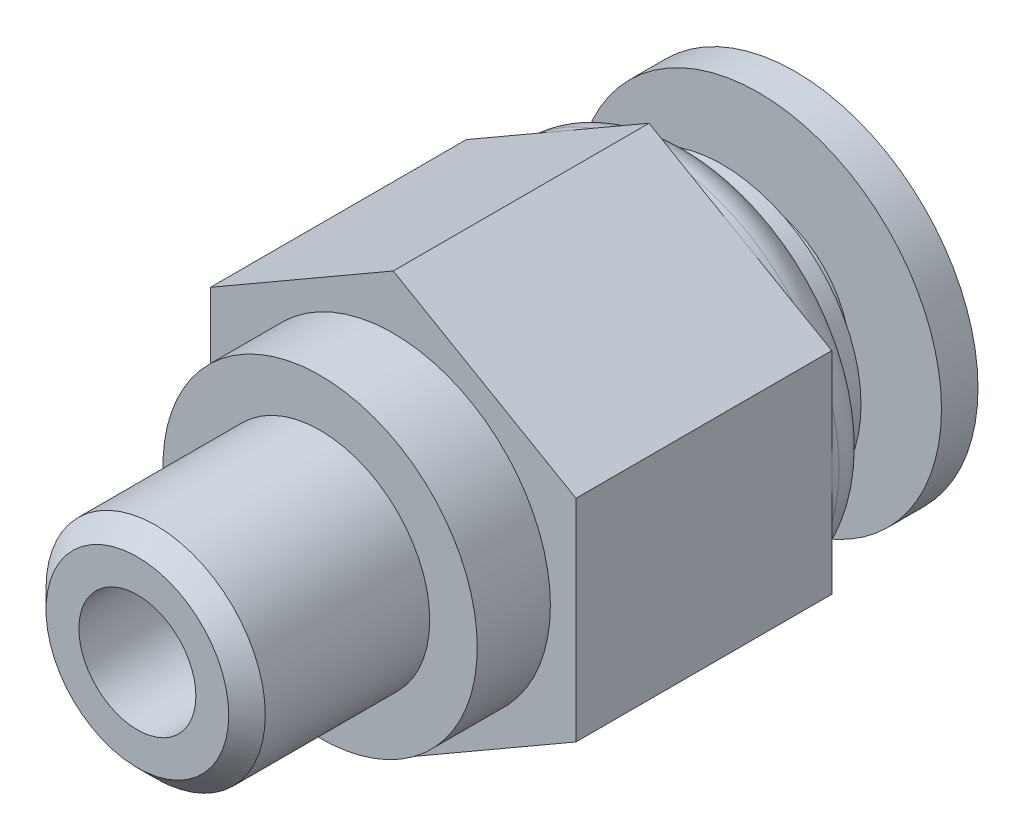
ISO-10303-21;
HEADER;
FILE_DESCRIPTION(('STEP AP214'),'2;1');
FILE_NAME('part.step','',(''),(''),'','','');
FILE_SCHEMA(('AUTOMOTIVE_DESIGN { 1 0 10303 214 1 1 1 1 }'));
ENDSEC;
DATA;
#1=APPLICATION_CONTEXT('core data for automotive mechanical design processes');
#2=APPLICATION_PROTOCOL_DEFINITION('international standard','automotive_design',2000,#1);
#3=PRODUCT_CONTEXT('',#1,'mechanical');
#4=PRODUCT('Part','Part','',(#3));
#5=PRODUCT_RELATED_PRODUCT_CATEGORY('part','',(#4));
#6=PRODUCT_DEFINITION_FORMATION('','',#4);
#7=PRODUCT_DEFINITION_CONTEXT('part definition',#1,'design');
#8=PRODUCT_DEFINITION('design','',#6,#7);
#9=PRODUCT_DEFINITION_SHAPE('','',#8);
#10=(LENGTH_UNIT() NAMED_UNIT(*) SI_UNIT(.MILLI.,.METRE.));
#11=(NAMED_UNIT(*) PLANE_ANGLE_UNIT() SI_UNIT($,.RADIAN.));
#12=(NAMED_UNIT(*) SI_UNIT($,.STERADIAN.) SOLID_ANGLE_UNIT());
#13=UNCERTAINTY_MEASURE_WITH_UNIT(LENGTH_MEASURE(1.E-05),#10,'distance_accuracy_value','');
#14=(GEOMETRIC_REPRESENTATION_CONTEXT(3) GLOBAL_UNCERTAINTY_ASSIGNED_CONTEXT((#13)) GLOBAL_UNIT_ASSIGNED_CONTEXT((#10,
#11,#12)) REPRESENTATION_CONTEXT('',''));
#15=CARTESIAN_POINT('',(0.,0.,0.));
#16=DIRECTION('',(0.,0.,1.));
#17=DIRECTION('',(1.,0.,0.));
#18=AXIS2_PLACEMENT_3D('',#15,#16,#17);
#19=CARTESIAN_POINT('',(0.,2.,-4.));
#20=DIRECTION('',(0.,0.,1.));
#21=DIRECTION('',(0.,-1.,0.));
#22=AXIS2_PLACEMENT_3D('',#19,#20,#21);
#23=PLANE('',#22);
#24=CARTESIAN_POINT('',(0.,0.,-4.));
#25=DIRECTION('',(0.,0.,1.));
#26=DIRECTION('',(0.,-1.,0.));
#27=AXIS2_PLACEMENT_3D('',#24,#25,#26);
#28=CIRCLE('',#27,5.);
#29=CARTESIAN_POINT('',(0.,-5.,-4.));
#30=VERTEX_POINT('',#29);
#31=EDGE_CURVE('E63',#30,#30,#28,.T.);
#32=ORIENTED_EDGE('',*,*,#31,.T.);
#33=EDGE_LOOP('',(#32));
#34=FACE_BOUND('',#33,.T.);
#35=CARTESIAN_POINT('',(0.,0.,-4.));
#36=DIRECTION('',(0.,0.,1.));
#37=DIRECTION('',(0.,-1.,0.));
#38=AXIS2_PLACEMENT_3D('',#35,#36,#37);
#39=CIRCLE('',#38,2.);
#40=CARTESIAN_POINT('',(0.,-2.,-4.));
#41=VERTEX_POINT('',#40);
#42=EDGE_CURVE('E47',#41,#41,#39,.T.);
#43=ORIENTED_EDGE('',*,*,#42,.F.);
#44=EDGE_LOOP('',(#43));
#45=FACE_BOUND('',#44,.T.);
#46=ADVANCED_FACE('F44',(#34,#45),#23,.T.);
#47=CARTESIAN_POINT('',(0.,0.,1.31728685876942));
#48=DIRECTION('',(0.,0.,1.));
#49=DIRECTION('',(0.,-1.,0.));
#50=AXIS2_PLACEMENT_3D('',#47,#48,#49);
#51=CYLINDRICAL_SURFACE('',#50,2.);
#52=ORIENTED_EDGE('',*,*,#42,.T.);
#53=EDGE_LOOP('',(#52));
#54=FACE_BOUND('',#53,.T.);
#55=CARTESIAN_POINT('',(0.,0.,5.));
#56=DIRECTION('',(0.,0.,1.));
#57=DIRECTION('',(0.,-1.,0.));
#58=AXIS2_PLACEMENT_3D('',#55,#56,#57);
#59=CIRCLE('',#58,2.);
#60=CARTESIAN_POINT('',(0.,-2.,5.));
#61=VERTEX_POINT('',#60);
#62=EDGE_CURVE('E61',#61,#61,#59,.T.);
#63=ORIENTED_EDGE('',*,*,#62,.F.);
#64=EDGE_LOOP('',(#63));
#65=FACE_BOUND('',#64,.T.);
#66=ADVANCED_FACE('F70',(#54,#65),#51,.T.);
#67=CARTESIAN_POINT('',(0.,2.5,5.));
#68=DIRECTION('',(0.,0.,-1.));
#69=DIRECTION('',(0.,1.,0.));
#70=AXIS2_PLACEMENT_3D('',#67,#68,#69);
#71=PLANE('',#70);
#72=ORIENTED_EDGE('',*,*,#62,.T.);
#73=EDGE_LOOP('',(#72));
#74=FACE_BOUND('',#73,.T.);
#75=CARTESIAN_POINT('',(0.,0.,5.));
#76=DIRECTION('',(0.,0.,1.));
#77=DIRECTION('',(0.,-1.,0.));
#78=AXIS2_PLACEMENT_3D('',#75,#76,#77);
#79=CIRCLE('',#78,2.5);
#80=CARTESIAN_POINT('',(0.,-2.5,5.));
#81=VERTEX_POINT('',#80);
#82=EDGE_CURVE('E56',#81,#81,#79,.T.);
#83=ORIENTED_EDGE('',*,*,#82,.F.);
#84=EDGE_LOOP('',(#83));
#85=FACE_BOUND('',#84,.T.);
#86=ADVANCED_FACE('F79',(#74,#85),#71,.T.);
#87=CARTESIAN_POINT('',(0.,0.,1.31728685876942));
#88=DIRECTION('',(0.,0.,1.));
#89=DIRECTION('',(0.,-1.,0.));
#90=AXIS2_PLACEMENT_3D('',#87,#88,#89);
#91=CYLINDRICAL_SURFACE('',#90,2.5);
#92=ORIENTED_EDGE('',*,*,#82,.T.);
#93=EDGE_LOOP('',(#92));
#94=FACE_BOUND('',#93,.T.);
#95=CARTESIAN_POINT('',(0.,0.,-3.));
#96=DIRECTION('',(0.,0.,1.));
#97=DIRECTION('',(0.,-1.,0.));
#98=AXIS2_PLACEMENT_3D('',#95,#96,#97);
#99=CIRCLE('',#98,2.5);
#100=CARTESIAN_POINT('',(0.,-2.5,-3.));
#101=VERTEX_POINT('',#100);
#102=EDGE_CURVE('E51',#101,#101,#99,.T.);
#103=ORIENTED_EDGE('',*,*,#102,.F.);
#104=EDGE_LOOP('',(#103));
#105=FACE_BOUND('',#104,.T.);
#106=ADVANCED_FACE('F86',(#94,#105),#91,.F.);
#107=CARTESIAN_POINT('',(0.,5.,-3.));
#108=DIRECTION('',(0.,0.,-1.));
#109=DIRECTION('',(0.,1.,0.));
#110=AXIS2_PLACEMENT_3D('',#107,#108,#109);
#111=PLANE('',#110);
#112=ORIENTED_EDGE('',*,*,#102,.T.);
#113=EDGE_LOOP('',(#112));
#114=FACE_BOUND('',#113,.T.);
#115=CARTESIAN_POINT('',(0.,0.,-3.));
#116=DIRECTION('',(0.,0.,1.));
#117=DIRECTION('',(0.,-1.,0.));
#118=AXIS2_PLACEMENT_3D('',#115,#116,#117);
#119=CIRCLE('',#118,5.);
#120=CARTESIAN_POINT('',(0.,-5.,-3.));
#121=VERTEX_POINT('',#120);
#122=EDGE_CURVE('E11',#121,#121,#119,.T.);
#123=ORIENTED_EDGE('',*,*,#122,.F.);
#124=EDGE_LOOP('',(#123));
#125=FACE_BOUND('',#124,.T.);
#126=ADVANCED_FACE('F82',(#114,#125),#111,.T.);
#127=CARTESIAN_POINT('',(0.,0.,1.31728685876942));
#128=DIRECTION('',(0.,0.,1.));
#129=DIRECTION('',(0.,-1.,0.));
#130=AXIS2_PLACEMENT_3D('',#127,#128,#129);
#131=CYLINDRICAL_SURFACE('',#130,5.);
#132=ORIENTED_EDGE('',*,*,#122,.T.);
#133=EDGE_LOOP('',(#132));
#134=FACE_BOUND('',#133,.T.);
#135=ORIENTED_EDGE('',*,*,#31,.F.);
#136=EDGE_LOOP('',(#135));
#137=FACE_BOUND('',#136,.T.);
#138=ADVANCED_FACE('F45',(#134,#137),#131,.F.);
#139=OPEN_SHELL('',(#46,#66,#86,#106,#126,#138));
#140=SHELL_BASED_SURFACE_MODEL('B2',(#139));
#141=CARTESIAN_POINT('',(0.,0.,-2.));
#142=DIRECTION('',(0.,0.,1.));
#143=DIRECTION('',(1.,0.,0.));
#144=AXIS2_PLACEMENT_3D('',#141,#142,#143);
#145=PLANE('',#144);
#146=CARTESIAN_POINT('',(0.,0.,-2.));
#147=DIRECTION('',(0.,0.,1.));
#148=DIRECTION('',(1.,0.,0.));
#149=AXIS2_PLACEMENT_3D('',#146,#147,#148);
#150=CIRCLE('',#149,3.8);
#151=CARTESIAN_POINT('',(3.8,0.,-2.));
#152=VERTEX_POINT('',#151);
#153=EDGE_CURVE('E275',#152,#152,#150,.T.);
#154=ORIENTED_EDGE('',*,*,#153,.F.);
#155=EDGE_LOOP('',(#154));
#156=FACE_BOUND('',#155,.T.);
#157=CARTESIAN_POINT('',(0.,0.,-2.));
#158=DIRECTION('',(0.,0.,1.));
#159=DIRECTION('',(1.,0.,0.));
#160=AXIS2_PLACEMENT_3D('',#157,#158,#159);
#161=CIRCLE('',#160,3.);
#162=CARTESIAN_POINT('',(3.,0.,-2.));
#163=VERTEX_POINT('',#162);
#164=EDGE_CURVE('E390',#163,#163,#161,.T.);
#165=ORIENTED_EDGE('',*,*,#164,.T.);
#166=EDGE_LOOP('',(#165));
#167=FACE_BOUND('',#166,.T.);
#168=ADVANCED_FACE('F135',(#156,#167),#145,.F.);
#169=CARTESIAN_POINT('',(0.,0.,14.));
#170=DIRECTION('',(0.,0.,1.));
#171=DIRECTION('',(1.,0.,0.));
#172=AXIS2_PLACEMENT_3D('',#169,#170,#171);
#173=PLANE('',#172);
#174=CARTESIAN_POINT('',(0.,0.,14.));
#175=DIRECTION('',(0.,0.,1.));
#176=DIRECTION('',(1.,0.,0.));
#177=AXIS2_PLACEMENT_3D('',#174,#175,#176);
#178=CIRCLE('',#177,2.5);
#179=CARTESIAN_POINT('',(2.5,0.,14.));
#180=VERTEX_POINT('',#179);
#181=EDGE_CURVE('E143',#180,#180,#178,.T.);
#182=ORIENTED_EDGE('',*,*,#181,.T.);
#183=EDGE_LOOP('',(#182));
#184=FACE_BOUND('',#183,.T.);
#185=CARTESIAN_POINT('',(0.,0.,14.));
#186=DIRECTION('',(0.,0.,1.));
#187=DIRECTION('',(1.,0.,0.));
#188=AXIS2_PLACEMENT_3D('',#185,#186,#187);
#189=CIRCLE('',#188,1.6);
#190=CARTESIAN_POINT('',(1.6,0.,14.));
#191=VERTEX_POINT('',#190);
#192=EDGE_CURVE('E285',#191,#191,#189,.T.);
#193=ORIENTED_EDGE('',*,*,#192,.F.);
#194=EDGE_LOOP('',(#193));
#195=FACE_BOUND('',#194,.T.);
#196=ADVANCED_FACE('F290',(#184,#195),#173,.T.);
#197=CARTESIAN_POINT('',(0.,0.,7.));
#198=DIRECTION('',(0.,0.,1.));
#199=DIRECTION('',(1.,0.,0.));
#200=AXIS2_PLACEMENT_3D('',#197,#198,#199);
#201=PLANE('',#200);
#202=DIRECTION('',(-0.866025403784439,0.5,0.));
#203=VECTOR('',#202,1.);
#204=CARTESIAN_POINT('',(5.,2.88675134594813,7.));
#205=LINE('',#204,#203);
#206=CARTESIAN_POINT('',(5.,2.88675134594813,7.));
#207=VERTEX_POINT('',#206);
#208=CARTESIAN_POINT('',(0.,5.77350269189626,7.));
#209=VERTEX_POINT('',#208);
#210=EDGE_CURVE('E255',#207,#209,#205,.T.);
#211=ORIENTED_EDGE('',*,*,#210,.T.);
#212=DIRECTION('',(-0.866025403784438,-0.5,0.));
#213=VECTOR('',#212,1.);
#214=CARTESIAN_POINT('',(0.,5.77350269189626,7.));
#215=LINE('',#214,#213);
#216=CARTESIAN_POINT('',(-5.,2.88675134594813,7.));
#217=VERTEX_POINT('',#216);
#218=EDGE_CURVE('E195',#209,#217,#215,.T.);
#219=ORIENTED_EDGE('',*,*,#218,.T.);
#220=DIRECTION('',(0.,-1.,0.));
#221=VECTOR('',#220,1.);
#222=CARTESIAN_POINT('',(-5.,2.88675134594813,7.));
#223=LINE('',#222,#221);
#224=CARTESIAN_POINT('',(-5.,-2.88675134594813,7.));
#225=VERTEX_POINT('',#224);
#226=EDGE_CURVE('E212',#217,#225,#223,.T.);
#227=ORIENTED_EDGE('',*,*,#226,.T.);
#228=DIRECTION('',(0.866025403784438,-0.5,0.));
#229=VECTOR('',#228,1.);
#230=CARTESIAN_POINT('',(-5.,-2.88675134594813,7.));
#231=LINE('',#230,#229);
#232=CARTESIAN_POINT('',(0.,-5.77350269189626,7.));
#233=VERTEX_POINT('',#232);
#234=EDGE_CURVE('E204',#225,#233,#231,.T.);
#235=ORIENTED_EDGE('',*,*,#234,.T.);
#236=DIRECTION('',(0.866025403784438,0.5,0.));
#237=VECTOR('',#236,1.);
#238=CARTESIAN_POINT('',(0.,-5.77350269189626,7.));
#239=LINE('',#238,#237);
#240=CARTESIAN_POINT('',(5.,-2.88675134594813,7.));
#241=VERTEX_POINT('',#240);
#242=EDGE_CURVE('E209',#233,#241,#239,.T.);
#243=ORIENTED_EDGE('',*,*,#242,.T.);
#244=DIRECTION('',(0.,1.,0.));
#245=VECTOR('',#244,1.);
#246=CARTESIAN_POINT('',(5.,-2.88675134594813,7.));
#247=LINE('',#246,#245);
#248=EDGE_CURVE('E159',#241,#207,#247,.T.);
#249=ORIENTED_EDGE('',*,*,#248,.T.);
#250=EDGE_LOOP('',(#211,#219,#227,#235,#243,#249));
#251=FACE_BOUND('',#250,.T.);
#252=CARTESIAN_POINT('',(0.,0.,7.));
#253=DIRECTION('',(0.,0.,1.));
#254=DIRECTION('',(1.,0.,0.));
#255=AXIS2_PLACEMENT_3D('',#252,#253,#254);
#256=CIRCLE('',#255,4.3);
#257=CARTESIAN_POINT('',(4.3,0.,7.));
#258=VERTEX_POINT('',#257);
#259=EDGE_CURVE('E268',#258,#258,#256,.F.);
#260=ORIENTED_EDGE('',*,*,#259,.T.);
#261=EDGE_LOOP('',(#260));
#262=FACE_BOUND('',#261,.T.);
#263=ADVANCED_FACE('F206',(#251,#262),#201,.T.);
#264=CARTESIAN_POINT('',(0.,0.,0.));
#265=DIRECTION('',(0.,0.,1.));
#266=DIRECTION('',(1.,0.,0.));
#267=AXIS2_PLACEMENT_3D('',#264,#265,#266);
#268=PLANE('',#267);
#269=DIRECTION('',(0.,1.,0.));
#270=VECTOR('',#269,1.);
#271=CARTESIAN_POINT('',(5.,-2.88675134594813,0.));
#272=LINE('',#271,#270);
#273=CARTESIAN_POINT('',(5.,0.,0.));
#274=VERTEX_POINT('',#273);
#275=CARTESIAN_POINT('',(5.,2.88675134594813,0.));
#276=VERTEX_POINT('',#275);
#277=EDGE_CURVE('E186',#274,#276,#272,.T.);
#278=ORIENTED_EDGE('',*,*,#277,.F.);
#279=CARTESIAN_POINT('',(0.,0.,0.));
#280=DIRECTION('',(0.,0.,1.));
#281=DIRECTION('',(1.,0.,0.));
#282=AXIS2_PLACEMENT_3D('',#279,#280,#281);
#283=CIRCLE('',#282,5.);
#284=CARTESIAN_POINT('',(2.5,4.33012701892219,0.));
#285=VERTEX_POINT('',#284);
#286=EDGE_CURVE('E150',#274,#285,#283,.T.);
#287=ORIENTED_EDGE('',*,*,#286,.T.);
#288=DIRECTION('',(-0.866025403784439,0.5,0.));
#289=VECTOR('',#288,1.);
#290=CARTESIAN_POINT('',(5.,2.88675134594813,0.));
#291=LINE('',#290,#289);
#292=EDGE_CURVE('E236',#276,#285,#291,.T.);
#293=ORIENTED_EDGE('',*,*,#292,.F.);
#294=EDGE_LOOP('',(#278,#287,#293));
#295=FACE_BOUND('',#294,.T.);
#296=ADVANCED_FACE('F344',(#295),#268,.F.);
#297=CARTESIAN_POINT('',(0.,5.77350269189626,0.));
#298=VERTEX_POINT('',#297);
#299=EDGE_CURVE('E240',#285,#298,#291,.T.);
#300=ORIENTED_EDGE('',*,*,#299,.F.);
#301=CARTESIAN_POINT('',(-2.5,4.33012701892219,0.));
#302=VERTEX_POINT('',#301);
#303=EDGE_CURVE('E280',#285,#302,#283,.T.);
#304=ORIENTED_EDGE('',*,*,#303,.T.);
#305=DIRECTION('',(-0.866025403784438,-0.5,0.));
#306=VECTOR('',#305,1.);
#307=CARTESIAN_POINT('',(0.,5.77350269189626,0.));
#308=LINE('',#307,#306);
#309=EDGE_CURVE('E241',#298,#302,#308,.T.);
#310=ORIENTED_EDGE('',*,*,#309,.F.);
#311=EDGE_LOOP('',(#300,#304,#310));
#312=FACE_BOUND('',#311,.T.);
#313=ADVANCED_FACE('F428',(#312),#268,.F.);
#314=CARTESIAN_POINT('',(-5.,2.88675134594813,0.));
#315=VERTEX_POINT('',#314);
#316=EDGE_CURVE('E239',#302,#315,#308,.T.);
#317=ORIENTED_EDGE('',*,*,#316,.F.);
#318=CARTESIAN_POINT('',(-5.,0.,0.));
#319=VERTEX_POINT('',#318);
#320=EDGE_CURVE('E413',#302,#319,#283,.T.);
#321=ORIENTED_EDGE('',*,*,#320,.T.);
#322=DIRECTION('',(0.,-1.,0.));
#323=VECTOR('',#322,1.);
#324=CARTESIAN_POINT('',(-5.,2.88675134594813,0.));
#325=LINE('',#324,#323);
#326=EDGE_CURVE('E245',#315,#319,#325,.T.);
#327=ORIENTED_EDGE('',*,*,#326,.F.);
#328=EDGE_LOOP('',(#317,#321,#327));
#329=FACE_BOUND('',#328,.T.);
#330=ADVANCED_FACE('F430',(#329),#268,.F.);
#331=CARTESIAN_POINT('',(-5.,-2.88675134594813,0.));
#332=VERTEX_POINT('',#331);
#333=EDGE_CURVE('E244',#319,#332,#325,.T.);
#334=ORIENTED_EDGE('',*,*,#333,.F.);
#335=CARTESIAN_POINT('',(-2.5,-4.33012701892219,0.));
#336=VERTEX_POINT('',#335);
#337=EDGE_CURVE('E409',#319,#336,#283,.T.);
#338=ORIENTED_EDGE('',*,*,#337,.T.);
#339=DIRECTION('',(0.866025403784438,-0.5,0.));
#340=VECTOR('',#339,1.);
#341=CARTESIAN_POINT('',(-5.,-2.88675134594813,0.));
#342=LINE('',#341,#340);
#343=EDGE_CURVE('E248',#332,#336,#342,.T.);
#344=ORIENTED_EDGE('',*,*,#343,.F.);
#345=EDGE_LOOP('',(#334,#338,#344));
#346=FACE_BOUND('',#345,.T.);
#347=ADVANCED_FACE('F406',(#346),#268,.F.);
#348=CARTESIAN_POINT('',(0.,-5.77350269189626,0.));
#349=VERTEX_POINT('',#348);
#350=EDGE_CURVE('E222',#336,#349,#342,.T.);
#351=ORIENTED_EDGE('',*,*,#350,.F.);
#352=CARTESIAN_POINT('',(2.5,-4.33012701892219,0.));
#353=VERTEX_POINT('',#352);
#354=EDGE_CURVE('E414',#336,#353,#283,.T.);
#355=ORIENTED_EDGE('',*,*,#354,.T.);
#356=DIRECTION('',(0.866025403784438,0.5,0.));
#357=VECTOR('',#356,1.);
#358=CARTESIAN_POINT('',(0.,-5.77350269189626,0.));
#359=LINE('',#358,#357);
#360=EDGE_CURVE('E251',#349,#353,#359,.T.);
#361=ORIENTED_EDGE('',*,*,#360,.F.);
#362=EDGE_LOOP('',(#351,#355,#361));
#363=FACE_BOUND('',#362,.T.);
#364=ADVANCED_FACE('F349',(#363),#268,.F.);
#365=CARTESIAN_POINT('',(5.,2.88675134594813,7.));
#366=DIRECTION('',(-0.5,-0.866025403784439,0.));
#367=DIRECTION('',(0.866025403784439,-0.5,0.));
#368=AXIS2_PLACEMENT_3D('',#365,#366,#367);
#369=PLANE('',#368);
#370=ORIENTED_EDGE('',*,*,#292,.T.);
#371=ORIENTED_EDGE('',*,*,#299,.T.);
#372=DIRECTION('',(0.,0.,-1.));
#373=VECTOR('',#372,1.);
#374=CARTESIAN_POINT('',(0.,5.77350269189626,7.));
#375=LINE('',#374,#373);
#376=EDGE_CURVE('E262',#209,#298,#375,.T.);
#377=ORIENTED_EDGE('',*,*,#376,.F.);
#378=ORIENTED_EDGE('',*,*,#210,.F.);
#379=DIRECTION('',(0.,0.,-1.));
#380=VECTOR('',#379,1.);
#381=CARTESIAN_POINT('',(5.,2.88675134594813,7.));
#382=LINE('',#381,#380);
#383=EDGE_CURVE('E232',#207,#276,#382,.T.);
#384=ORIENTED_EDGE('',*,*,#383,.T.);
#385=EDGE_LOOP('',(#370,#371,#377,#378,#384));
#386=FACE_BOUND('',#385,.T.);
#387=ADVANCED_FACE('F363',(#386),#369,.F.);
#388=CARTESIAN_POINT('',(0.,5.77350269189626,7.));
#389=DIRECTION('',(0.5,-0.866025403784438,0.));
#390=DIRECTION('',(0.866025403784439,0.5,0.));
#391=AXIS2_PLACEMENT_3D('',#388,#389,#390);
#392=PLANE('',#391);
#393=ORIENTED_EDGE('',*,*,#309,.T.);
#394=ORIENTED_EDGE('',*,*,#316,.T.);
#395=DIRECTION('',(0.,0.,-1.));
#396=VECTOR('',#395,1.);
#397=CARTESIAN_POINT('',(-5.,2.88675134594813,7.));
#398=LINE('',#397,#396);
#399=EDGE_CURVE('E259',#217,#315,#398,.T.);
#400=ORIENTED_EDGE('',*,*,#399,.F.);
#401=ORIENTED_EDGE('',*,*,#218,.F.);
#402=ORIENTED_EDGE('',*,*,#376,.T.);
#403=EDGE_LOOP('',(#393,#394,#400,#401,#402));
#404=FACE_BOUND('',#403,.T.);
#405=ADVANCED_FACE('F359',(#404),#392,.F.);
#406=CARTESIAN_POINT('',(-5.,2.88675134594813,7.));
#407=DIRECTION('',(1.,0.,0.));
#408=DIRECTION('',(0.,1.,0.));
#409=AXIS2_PLACEMENT_3D('',#406,#407,#408);
#410=PLANE('',#409);
#411=ORIENTED_EDGE('',*,*,#326,.T.);
#412=ORIENTED_EDGE('',*,*,#333,.T.);
#413=DIRECTION('',(0.,0.,-1.));
#414=VECTOR('',#413,1.);
#415=CARTESIAN_POINT('',(-5.,-2.88675134594813,7.));
#416=LINE('',#415,#414);
#417=EDGE_CURVE('E226',#225,#332,#416,.T.);
#418=ORIENTED_EDGE('',*,*,#417,.F.);
#419=ORIENTED_EDGE('',*,*,#226,.F.);
#420=ORIENTED_EDGE('',*,*,#399,.T.);
#421=EDGE_LOOP('',(#411,#412,#418,#419,#420));
#422=FACE_BOUND('',#421,.T.);
#423=ADVANCED_FACE('F356',(#422),#410,.F.);
#424=CARTESIAN_POINT('',(-5.,-2.88675134594813,7.));
#425=DIRECTION('',(0.5,0.866025403784438,0.));
#426=DIRECTION('',(-0.866025403784438,0.5,0.));
#427=AXIS2_PLACEMENT_3D('',#424,#425,#426);
#428=PLANE('',#427);
#429=ORIENTED_EDGE('',*,*,#343,.T.);
#430=ORIENTED_EDGE('',*,*,#350,.T.);
#431=DIRECTION('',(0.,0.,-1.));
#432=VECTOR('',#431,1.);
#433=CARTESIAN_POINT('',(0.,-5.77350269189626,7.));
#434=LINE('',#433,#432);
#435=EDGE_CURVE('E218',#233,#349,#434,.T.);
#436=ORIENTED_EDGE('',*,*,#435,.F.);
#437=ORIENTED_EDGE('',*,*,#234,.F.);
#438=ORIENTED_EDGE('',*,*,#417,.T.);
#439=EDGE_LOOP('',(#429,#430,#436,#437,#438));
#440=FACE_BOUND('',#439,.T.);
#441=ADVANCED_FACE('F220',(#440),#428,.F.);
#442=CARTESIAN_POINT('',(0.,-5.77350269189626,7.));
#443=DIRECTION('',(-0.5,0.866025403784439,0.));
#444=DIRECTION('',(-0.866025403784439,-0.5,0.));
#445=AXIS2_PLACEMENT_3D('',#442,#443,#444);
#446=PLANE('',#445);
#447=ORIENTED_EDGE('',*,*,#360,.T.);
#448=CARTESIAN_POINT('',(5.,-2.88675134594813,0.));
#449=VERTEX_POINT('',#448);
#450=EDGE_CURVE('E250',#353,#449,#359,.T.);
#451=ORIENTED_EDGE('',*,*,#450,.T.);
#452=DIRECTION('',(0.,0.,-1.));
#453=VECTOR('',#452,1.);
#454=CARTESIAN_POINT('',(5.,-2.88675134594813,7.));
#455=LINE('',#454,#453);
#456=EDGE_CURVE('E227',#241,#449,#455,.T.);
#457=ORIENTED_EDGE('',*,*,#456,.F.);
#458=ORIENTED_EDGE('',*,*,#242,.F.);
#459=ORIENTED_EDGE('',*,*,#435,.T.);
#460=EDGE_LOOP('',(#447,#451,#457,#458,#459));
#461=FACE_BOUND('',#460,.T.);
#462=ADVANCED_FACE('F229',(#461),#446,.F.);
#463=CARTESIAN_POINT('',(5.,-2.88675134594813,7.));
#464=DIRECTION('',(-1.,0.,0.));
#465=DIRECTION('',(0.,0.,1.));
#466=AXIS2_PLACEMENT_3D('',#463,#464,#465);
#467=PLANE('',#466);
#468=EDGE_CURVE('E253',#449,#274,#272,.T.);
#469=ORIENTED_EDGE('',*,*,#468,.T.);
#470=ORIENTED_EDGE('',*,*,#277,.T.);
#471=ORIENTED_EDGE('',*,*,#383,.F.);
#472=ORIENTED_EDGE('',*,*,#248,.F.);
#473=ORIENTED_EDGE('',*,*,#456,.T.);
#474=EDGE_LOOP('',(#469,#470,#471,#472,#473));
#475=FACE_BOUND('',#474,.T.);
#476=ADVANCED_FACE('F347',(#475),#467,.F.);
#477=ORIENTED_EDGE('',*,*,#450,.F.);
#478=EDGE_CURVE('E264',#353,#274,#283,.T.);
#479=ORIENTED_EDGE('',*,*,#478,.T.);
#480=ORIENTED_EDGE('',*,*,#468,.F.);
#481=EDGE_LOOP('',(#477,#479,#480));
#482=FACE_BOUND('',#481,.T.);
#483=ADVANCED_FACE('F340',(#482),#268,.F.);
#484=CARTESIAN_POINT('',(0.,0.,-1.2));
#485=DIRECTION('',(0.,0.,1.));
#486=DIRECTION('',(1.,0.,0.));
#487=AXIS2_PLACEMENT_3D('',#484,#485,#486);
#488=CYLINDRICAL_SURFACE('',#487,5.);
#489=CARTESIAN_POINT('',(0.,0.,-0.2));
#490=DIRECTION('',(0.,0.,1.));
#491=DIRECTION('',(1.,0.,0.));
#492=AXIS2_PLACEMENT_3D('',#489,#490,#491);
#493=CIRCLE('',#492,5.);
#494=CARTESIAN_POINT('',(5.,0.,-0.2));
#495=VERTEX_POINT('',#494);
#496=EDGE_CURVE('E276',#495,#495,#493,.T.);
#497=ORIENTED_EDGE('',*,*,#496,.T.);
#498=EDGE_LOOP('',(#497));
#499=FACE_BOUND('',#498,.T.);
#500=ORIENTED_EDGE('',*,*,#286,.F.);
#501=ORIENTED_EDGE('',*,*,#478,.F.);
#502=ORIENTED_EDGE('',*,*,#354,.F.);
#503=ORIENTED_EDGE('',*,*,#337,.F.);
#504=ORIENTED_EDGE('',*,*,#320,.F.);
#505=ORIENTED_EDGE('',*,*,#303,.F.);
#506=EDGE_LOOP('',(#500,#501,#502,#503,#504,#505));
#507=FACE_BOUND('',#506,.T.);
#508=ADVANCED_FACE('F336',(#499,#507),#488,.T.);
#509=CARTESIAN_POINT('',(0.,0.,-1.2));
#510=DIRECTION('',(0.,0.,1.));
#511=DIRECTION('',(1.,0.,0.));
#512=AXIS2_PLACEMENT_3D('',#509,#510,#511);
#513=PLANE('',#512);
#514=CARTESIAN_POINT('',(0.,0.,-1.2));
#515=DIRECTION('',(0.,0.,1.));
#516=DIRECTION('',(1.,0.,0.));
#517=AXIS2_PLACEMENT_3D('',#514,#515,#516);
#518=CIRCLE('',#517,4.);
#519=CARTESIAN_POINT('',(4.,0.,-1.2));
#520=VERTEX_POINT('',#519);
#521=EDGE_CURVE('E279',#520,#520,#518,.F.);
#522=ORIENTED_EDGE('',*,*,#521,.T.);
#523=EDGE_LOOP('',(#522));
#524=FACE_BOUND('',#523,.T.);
#525=CARTESIAN_POINT('',(0.,0.,-1.2));
#526=DIRECTION('',(0.,0.,1.));
#527=DIRECTION('',(1.,0.,0.));
#528=AXIS2_PLACEMENT_3D('',#525,#526,#527);
#529=CIRCLE('',#528,3.8);
#530=CARTESIAN_POINT('',(3.8,0.,-1.2));
#531=VERTEX_POINT('',#530);
#532=EDGE_CURVE('E272',#531,#531,#529,.T.);
#533=ORIENTED_EDGE('',*,*,#532,.T.);
#534=EDGE_LOOP('',(#533));
#535=FACE_BOUND('',#534,.T.);
#536=ADVANCED_FACE('F326',(#524,#535),#513,.F.);
#537=CARTESIAN_POINT('',(0.,0.,9.));
#538=DIRECTION('',(0.,0.,1.));
#539=DIRECTION('',(1.,0.,0.));
#540=AXIS2_PLACEMENT_3D('',#537,#538,#539);
#541=PLANE('',#540);
#542=CARTESIAN_POINT('',(0.,0.,9.));
#543=DIRECTION('',(0.,0.,1.));
#544=DIRECTION('',(1.,0.,0.));
#545=AXIS2_PLACEMENT_3D('',#542,#543,#544);
#546=CIRCLE('',#545,4.3);
#547=CARTESIAN_POINT('',(4.3,0.,9.));
#548=VERTEX_POINT('',#547);
#549=EDGE_CURVE('E269',#548,#548,#546,.T.);
#550=ORIENTED_EDGE('',*,*,#549,.T.);
#551=EDGE_LOOP('',(#550));
#552=FACE_BOUND('',#551,.T.);
#553=CARTESIAN_POINT('',(0.,0.,9.));
#554=DIRECTION('',(0.,0.,1.));
#555=DIRECTION('',(1.,0.,0.));
#556=AXIS2_PLACEMENT_3D('',#553,#554,#555);
#557=CIRCLE('',#556,3.);
#558=CARTESIAN_POINT('',(3.,0.,9.));
#559=VERTEX_POINT('',#558);
#560=EDGE_CURVE('E265',#559,#559,#557,.T.);
#561=ORIENTED_EDGE('',*,*,#560,.F.);
#562=EDGE_LOOP('',(#561));
#563=FACE_BOUND('',#562,.T.);
#564=ADVANCED_FACE('F322',(#552,#563),#541,.T.);
#565=CARTESIAN_POINT('',(0.,0.,9.));
#566=DIRECTION('',(0.,0.,-1.));
#567=DIRECTION('',(-1.,0.,0.));
#568=AXIS2_PLACEMENT_3D('',#565,#566,#567);
#569=CYLINDRICAL_SURFACE('',#568,4.3);
#570=ORIENTED_EDGE('',*,*,#259,.F.);
#571=EDGE_LOOP('',(#570));
#572=FACE_BOUND('',#571,.T.);
#573=ORIENTED_EDGE('',*,*,#549,.F.);
#574=EDGE_LOOP('',(#573));
#575=FACE_BOUND('',#574,.T.);
#576=ADVANCED_FACE('F325',(#572,#575),#569,.T.);
#577=CARTESIAN_POINT('',(0.,0.,14.));
#578=DIRECTION('',(0.,0.,-1.));
#579=DIRECTION('',(-1.,0.,0.));
#580=AXIS2_PLACEMENT_3D('',#577,#578,#579);
#581=CYLINDRICAL_SURFACE('',#580,3.);
#582=CARTESIAN_POINT('',(0.,0.,13.5));
#583=DIRECTION('',(0.,0.,1.));
#584=DIRECTION('',(1.,0.,0.));
#585=AXIS2_PLACEMENT_3D('',#582,#583,#584);
#586=CIRCLE('',#585,3.);
#587=CARTESIAN_POINT('',(3.,0.,13.5));
#588=VERTEX_POINT('',#587);
#589=EDGE_CURVE('E42',#588,#588,#586,.F.);
#590=ORIENTED_EDGE('',*,*,#589,.T.);
#591=EDGE_LOOP('',(#590));
#592=FACE_BOUND('',#591,.T.);
#593=ORIENTED_EDGE('',*,*,#560,.T.);
#594=EDGE_LOOP('',(#593));
#595=FACE_BOUND('',#594,.T.);
#596=ADVANCED_FACE('F320',(#592,#595),#581,.T.);
#597=CARTESIAN_POINT('',(0.,0.,-2.));
#598=DIRECTION('',(0.,0.,1.));
#599=DIRECTION('',(1.,0.,0.));
#600=AXIS2_PLACEMENT_3D('',#597,#598,#599);
#601=CYLINDRICAL_SURFACE('',#600,3.8);
#602=ORIENTED_EDGE('',*,*,#153,.T.);
#603=EDGE_LOOP('',(#602));
#604=FACE_BOUND('',#603,.T.);
#605=ORIENTED_EDGE('',*,*,#532,.F.);
#606=EDGE_LOOP('',(#605));
#607=FACE_BOUND('',#606,.T.);
#608=ADVANCED_FACE('F316',(#604,#607),#601,.T.);
#609=CARTESIAN_POINT('',(0.,0.,-0.2));
#610=DIRECTION('',(0.,0.,1.));
#611=DIRECTION('',(1.,0.,0.));
#612=AXIS2_PLACEMENT_3D('',#609,#610,#611);
#613=TOROIDAL_SURFACE('',#612,4.,1.);
#614=ORIENTED_EDGE('',*,*,#521,.F.);
#615=EDGE_LOOP('',(#614));
#616=FACE_BOUND('',#615,.T.);
#617=ORIENTED_EDGE('',*,*,#496,.F.);
#618=EDGE_LOOP('',(#617));
#619=FACE_BOUND('',#618,.T.);
#620=ADVANCED_FACE('F319',(#616,#619),#613,.T.);
#621=CARTESIAN_POINT('',(0.,0.,14.));
#622=DIRECTION('',(0.,0.,-1.));
#623=DIRECTION('',(-1.,0.,0.));
#624=AXIS2_PLACEMENT_3D('',#621,#622,#623);
#625=CYLINDRICAL_SURFACE('',#624,1.6);
#626=CARTESIAN_POINT('',(0.,0.,5.));
#627=DIRECTION('',(0.,0.,1.));
#628=DIRECTION('',(1.,0.,0.));
#629=AXIS2_PLACEMENT_3D('',#626,#627,#628);
#630=CIRCLE('',#629,1.6);
#631=CARTESIAN_POINT('',(1.6,0.,5.));
#632=VERTEX_POINT('',#631);
#633=EDGE_CURVE('E283',#632,#632,#630,.T.);
#634=ORIENTED_EDGE('',*,*,#633,.F.);
#635=EDGE_LOOP('',(#634));
#636=FACE_BOUND('',#635,.T.);
#637=ORIENTED_EDGE('',*,*,#192,.T.);
#638=EDGE_LOOP('',(#637));
#639=FACE_BOUND('',#638,.T.);
#640=ADVANCED_FACE('F314',(#636,#639),#625,.F.);
#641=CARTESIAN_POINT('',(0.,0.,5.));
#642=DIRECTION('',(0.,0.,-1.));
#643=DIRECTION('',(-1.,0.,0.));
#644=AXIS2_PLACEMENT_3D('',#641,#642,#643);
#645=CYLINDRICAL_SURFACE('',#644,3.);
#646=CARTESIAN_POINT('',(0.,0.,5.));
#647=DIRECTION('',(0.,0.,1.));
#648=DIRECTION('',(1.,0.,0.));
#649=AXIS2_PLACEMENT_3D('',#646,#647,#648);
#650=CIRCLE('',#649,3.);
#651=CARTESIAN_POINT('',(3.,0.,5.));
#652=VERTEX_POINT('',#651);
#653=EDGE_CURVE('E286',#652,#652,#650,.T.);
#654=ORIENTED_EDGE('',*,*,#653,.T.);
#655=EDGE_LOOP('',(#654));
#656=FACE_BOUND('',#655,.T.);
#657=ORIENTED_EDGE('',*,*,#164,.F.);
#658=EDGE_LOOP('',(#657));
#659=FACE_BOUND('',#658,.T.);
#660=ADVANCED_FACE('F299',(#656,#659),#645,.F.);
#661=CARTESIAN_POINT('',(0.,0.,5.));
#662=DIRECTION('',(0.,0.,1.));
#663=DIRECTION('',(1.,0.,0.));
#664=AXIS2_PLACEMENT_3D('',#661,#662,#663);
#665=PLANE('',#664);
#666=ORIENTED_EDGE('',*,*,#633,.T.);
#667=EDGE_LOOP('',(#666));
#668=FACE_BOUND('',#667,.T.);
#669=ORIENTED_EDGE('',*,*,#653,.F.);
#670=EDGE_LOOP('',(#669));
#671=FACE_BOUND('',#670,.T.);
#672=ADVANCED_FACE('F294',(#668,#671),#665,.F.);
#673=CARTESIAN_POINT('',(0.,0.,14.));
#674=DIRECTION('',(0.,0.,-1.));
#675=DIRECTION('',(-1.,0.,0.));
#676=AXIS2_PLACEMENT_3D('',#673,#674,#675);
#677=CONICAL_SURFACE('',#676,2.5,0.785398163397446);
#678=ORIENTED_EDGE('',*,*,#589,.F.);
#679=EDGE_LOOP('',(#678));
#680=FACE_BOUND('',#679,.T.);
#681=ORIENTED_EDGE('',*,*,#181,.F.);
#682=EDGE_LOOP('',(#681));
#683=FACE_BOUND('',#682,.T.);
#684=ADVANCED_FACE('F137',(#680,#683),#677,.T.);
#685=CLOSED_SHELL('',(#168,#196,#263,#296,#313,#330,#347,#364,#387,#405,#423,#441,#462,#476,
#483,#508,#536,#564,#576,#596,#608,#620,#640,#660,#672,#684));
#686=MANIFOLD_SOLID_BREP('B6',#685);
#687=ADVANCED_BREP_SHAPE_REPRESENTATION('',(#18,#686),#14);
#688=MANIFOLD_SURFACE_SHAPE_REPRESENTATION('',(#18,#140),#14);
#689=SHAPE_REPRESENTATION('',(#18),#14);
#690=SHAPE_DEFINITION_REPRESENTATION(#9,#689);
#691=SHAPE_REPRESENTATION_RELATIONSHIP('','',#689,#687);
#692=SHAPE_REPRESENTATION_RELATIONSHIP('','',#689,#688);
ENDSEC;
END-ISO-10303-21;
